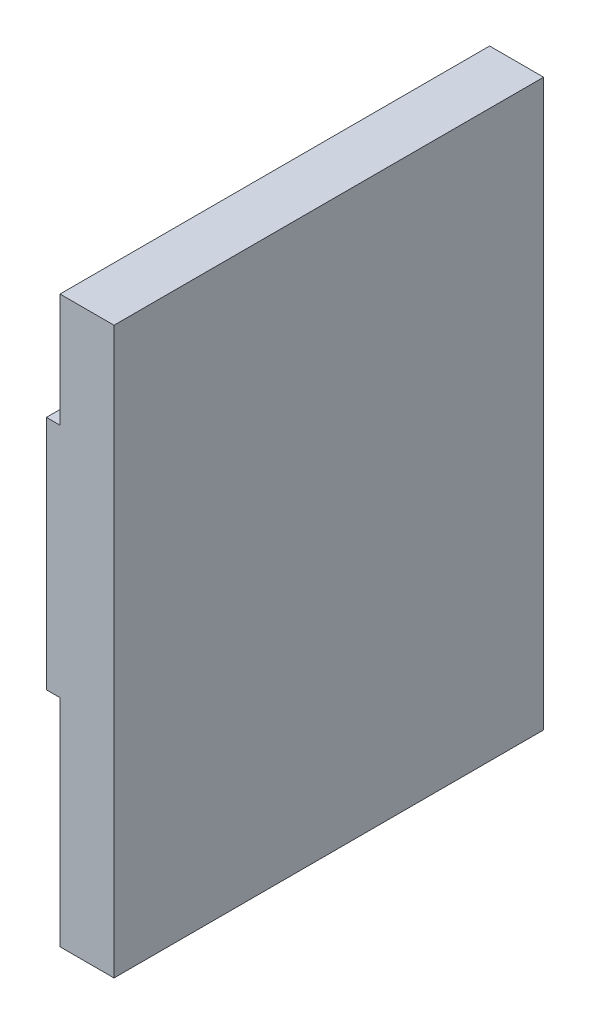
ISO-10303-21;
HEADER;
FILE_DESCRIPTION(('STEP AP214'),'2;1');
FILE_NAME('part.step','',(''),(''),'','','');
FILE_SCHEMA(('AUTOMOTIVE_DESIGN { 1 0 10303 214 1 1 1 1 }'));
ENDSEC;
DATA;
#1=APPLICATION_CONTEXT('core data for automotive mechanical design processes');
#2=APPLICATION_PROTOCOL_DEFINITION('international standard','automotive_design',2000,#1);
#3=PRODUCT_CONTEXT('',#1,'mechanical');
#4=PRODUCT('Part','Part','',(#3));
#5=PRODUCT_RELATED_PRODUCT_CATEGORY('part','',(#4));
#6=PRODUCT_DEFINITION_FORMATION('','',#4);
#7=PRODUCT_DEFINITION_CONTEXT('part definition',#1,'design');
#8=PRODUCT_DEFINITION('design','',#6,#7);
#9=PRODUCT_DEFINITION_SHAPE('','',#8);
#10=(LENGTH_UNIT() NAMED_UNIT(*) SI_UNIT(.MILLI.,.METRE.));
#11=(NAMED_UNIT(*) PLANE_ANGLE_UNIT() SI_UNIT($,.RADIAN.));
#12=(NAMED_UNIT(*) SI_UNIT($,.STERADIAN.) SOLID_ANGLE_UNIT());
#13=UNCERTAINTY_MEASURE_WITH_UNIT(LENGTH_MEASURE(1.E-05),#10,'distance_accuracy_value','');
#14=(GEOMETRIC_REPRESENTATION_CONTEXT(3) GLOBAL_UNCERTAINTY_ASSIGNED_CONTEXT((#13)) GLOBAL_UNIT_ASSIGNED_CONTEXT((#10,
#11,#12)) REPRESENTATION_CONTEXT('',''));
#15=CARTESIAN_POINT('',(0.,0.,0.));
#16=DIRECTION('',(0.,0.,1.));
#17=DIRECTION('',(1.,0.,0.));
#18=AXIS2_PLACEMENT_3D('',#15,#16,#17);
#19=CARTESIAN_POINT('',(-358.5,-1073.,313.5));
#20=DIRECTION('',(0.,0.,-1.));
#21=DIRECTION('',(0.,1.,0.));
#22=AXIS2_PLACEMENT_3D('',#19,#20,#21);
#23=PLANE('',#22);
#24=DIRECTION('',(0.,1.,0.));
#25=VECTOR('',#24,1.);
#26=CARTESIAN_POINT('',(-289.,-1073.,313.5));
#27=LINE('',#26,#25);
#28=CARTESIAN_POINT('',(-289.,-1674.,313.5));
#29=VERTEX_POINT('',#28);
#30=CARTESIAN_POINT('',(-289.,-512.,313.5));
#31=VERTEX_POINT('',#30);
#32=EDGE_CURVE('E83',#29,#31,#27,.T.);
#33=ORIENTED_EDGE('',*,*,#32,.F.);
#34=DIRECTION('',(1.,0.,0.));
#35=VECTOR('',#34,1.);
#36=CARTESIAN_POINT('',(-344.5,-1674.,313.5));
#37=LINE('',#36,#35);
#38=CARTESIAN_POINT('',(-400.,-1674.,313.5));
#39=VERTEX_POINT('',#38);
#40=EDGE_CURVE('E141',#39,#29,#37,.T.);
#41=ORIENTED_EDGE('',*,*,#40,.F.);
#42=DIRECTION('',(0.,-1.,0.));
#43=VECTOR('',#42,1.);
#44=CARTESIAN_POINT('',(-400.,-1432.25,313.5));
#45=LINE('',#44,#43);
#46=CARTESIAN_POINT('',(-400.,-1230.5,313.5));
#47=VERTEX_POINT('',#46);
#48=EDGE_CURVE('E142',#47,#39,#45,.T.);
#49=ORIENTED_EDGE('',*,*,#48,.F.);
#50=DIRECTION('',(1.,0.,0.));
#51=VECTOR('',#50,1.);
#52=CARTESIAN_POINT('',(-414.,-1230.5,313.5));
#53=LINE('',#52,#51);
#54=CARTESIAN_POINT('',(-428.,-1230.5,313.5));
#55=VERTEX_POINT('',#54);
#56=EDGE_CURVE('E144',#55,#47,#53,.T.);
#57=ORIENTED_EDGE('',*,*,#56,.F.);
#58=DIRECTION('',(0.,-1.,0.));
#59=VECTOR('',#58,1.);
#60=CARTESIAN_POINT('',(-428.,-988.,313.5));
#61=LINE('',#60,#59);
#62=CARTESIAN_POINT('',(-428.,-745.5,313.5));
#63=VERTEX_POINT('',#62);
#64=EDGE_CURVE('E108',#63,#55,#61,.T.);
#65=ORIENTED_EDGE('',*,*,#64,.F.);
#66=DIRECTION('',(1.,0.,0.));
#67=VECTOR('',#66,1.);
#68=CARTESIAN_POINT('',(-414.,-745.5,313.5));
#69=LINE('',#68,#67);
#70=CARTESIAN_POINT('',(-400.,-745.5,313.5));
#71=VERTEX_POINT('',#70);
#72=EDGE_CURVE('E114',#71,#63,#69,.F.);
#73=ORIENTED_EDGE('',*,*,#72,.F.);
#74=DIRECTION('',(0.,-1.,0.));
#75=VECTOR('',#74,1.);
#76=CARTESIAN_POINT('',(-400.,-628.75,313.5));
#77=LINE('',#76,#75);
#78=CARTESIAN_POINT('',(-400.,-512.,313.5));
#79=VERTEX_POINT('',#78);
#80=EDGE_CURVE('E161',#79,#71,#77,.T.);
#81=ORIENTED_EDGE('',*,*,#80,.F.);
#82=DIRECTION('',(1.,0.,0.));
#83=VECTOR('',#82,1.);
#84=CARTESIAN_POINT('',(-344.5,-512.,313.5));
#85=LINE('',#84,#83);
#86=EDGE_CURVE('E168',#31,#79,#85,.F.);
#87=ORIENTED_EDGE('',*,*,#86,.F.);
#88=EDGE_LOOP('',(#33,#41,#49,#57,#65,#73,#81,#87));
#89=FACE_BOUND('',#88,.T.);
#90=ADVANCED_FACE('F18',(#89),#23,.T.);
#91=CARTESIAN_POINT('',(-344.5,-1674.,755.));
#92=DIRECTION('',(0.,-1.,0.));
#93=DIRECTION('',(0.,0.,-1.));
#94=AXIS2_PLACEMENT_3D('',#91,#92,#93);
#95=PLANE('',#94);
#96=DIRECTION('',(0.,0.,-1.));
#97=VECTOR('',#96,1.);
#98=CARTESIAN_POINT('',(-289.,-1674.,755.));
#99=LINE('',#98,#97);
#100=CARTESIAN_POINT('',(-289.,-1674.,1196.5));
#101=VERTEX_POINT('',#100);
#102=EDGE_CURVE('E137',#101,#29,#99,.T.);
#103=ORIENTED_EDGE('',*,*,#102,.F.);
#104=DIRECTION('',(-1.,0.,0.));
#105=VECTOR('',#104,1.);
#106=CARTESIAN_POINT('',(-358.5,-1674.,1196.5));
#107=LINE('',#106,#105);
#108=CARTESIAN_POINT('',(-400.,-1674.,1196.5));
#109=VERTEX_POINT('',#108);
#110=EDGE_CURVE('E22',#101,#109,#107,.T.);
#111=ORIENTED_EDGE('',*,*,#110,.T.);
#112=DIRECTION('',(0.,0.,1.));
#113=VECTOR('',#112,1.);
#114=CARTESIAN_POINT('',(-400.,-1674.,755.));
#115=LINE('',#114,#113);
#116=EDGE_CURVE('E69',#39,#109,#115,.T.);
#117=ORIENTED_EDGE('',*,*,#116,.F.);
#118=ORIENTED_EDGE('',*,*,#40,.T.);
#119=EDGE_LOOP('',(#103,#111,#117,#118));
#120=FACE_BOUND('',#119,.T.);
#121=ADVANCED_FACE('F20',(#120),#95,.T.);
#122=CARTESIAN_POINT('',(-400.,-1432.25,755.));
#123=DIRECTION('',(-1.,0.,0.));
#124=DIRECTION('',(0.,-1.,0.));
#125=AXIS2_PLACEMENT_3D('',#122,#123,#124);
#126=PLANE('',#125);
#127=ORIENTED_EDGE('',*,*,#116,.T.);
#128=DIRECTION('',(0.,-1.,0.));
#129=VECTOR('',#128,1.);
#130=CARTESIAN_POINT('',(-400.,-1432.25,1196.5));
#131=LINE('',#130,#129);
#132=CARTESIAN_POINT('',(-400.,-1230.5,1196.5));
#133=VERTEX_POINT('',#132);
#134=EDGE_CURVE('E130',#109,#133,#131,.F.);
#135=ORIENTED_EDGE('',*,*,#134,.T.);
#136=DIRECTION('',(0.,0.,-1.));
#137=VECTOR('',#136,1.);
#138=CARTESIAN_POINT('',(-400.,-1230.5,755.));
#139=LINE('',#138,#137);
#140=EDGE_CURVE('E128',#47,#133,#139,.F.);
#141=ORIENTED_EDGE('',*,*,#140,.F.);
#142=ORIENTED_EDGE('',*,*,#48,.T.);
#143=EDGE_LOOP('',(#127,#135,#141,#142));
#144=FACE_BOUND('',#143,.T.);
#145=ADVANCED_FACE('F205',(#144),#126,.T.);
#146=CARTESIAN_POINT('',(-414.,-1230.5,755.));
#147=DIRECTION('',(0.,-1.,0.));
#148=DIRECTION('',(0.,0.,-1.));
#149=AXIS2_PLACEMENT_3D('',#146,#147,#148);
#150=PLANE('',#149);
#151=ORIENTED_EDGE('',*,*,#140,.T.);
#152=DIRECTION('',(1.,0.,0.));
#153=VECTOR('',#152,1.);
#154=CARTESIAN_POINT('',(-414.,-1230.5,1196.5));
#155=LINE('',#154,#153);
#156=CARTESIAN_POINT('',(-428.,-1230.5,1196.5));
#157=VERTEX_POINT('',#156);
#158=EDGE_CURVE('E120',#133,#157,#155,.F.);
#159=ORIENTED_EDGE('',*,*,#158,.T.);
#160=DIRECTION('',(0.,0.,1.));
#161=VECTOR('',#160,1.);
#162=CARTESIAN_POINT('',(-428.,-1230.5,755.));
#163=LINE('',#162,#161);
#164=EDGE_CURVE('E101',#55,#157,#163,.T.);
#165=ORIENTED_EDGE('',*,*,#164,.F.);
#166=ORIENTED_EDGE('',*,*,#56,.T.);
#167=EDGE_LOOP('',(#151,#159,#165,#166));
#168=FACE_BOUND('',#167,.T.);
#169=ADVANCED_FACE('F126',(#168),#150,.T.);
#170=CARTESIAN_POINT('',(-428.,-988.,755.));
#171=DIRECTION('',(-1.,0.,0.));
#172=DIRECTION('',(0.,-1.,0.));
#173=AXIS2_PLACEMENT_3D('',#170,#171,#172);
#174=PLANE('',#173);
#175=ORIENTED_EDGE('',*,*,#164,.T.);
#176=DIRECTION('',(0.,-1.,0.));
#177=VECTOR('',#176,1.);
#178=CARTESIAN_POINT('',(-428.,-988.,1196.5));
#179=LINE('',#178,#177);
#180=CARTESIAN_POINT('',(-428.,-745.5,1196.5));
#181=VERTEX_POINT('',#180);
#182=EDGE_CURVE('E105',#157,#181,#179,.F.);
#183=ORIENTED_EDGE('',*,*,#182,.T.);
#184=DIRECTION('',(0.,0.,1.));
#185=VECTOR('',#184,1.);
#186=CARTESIAN_POINT('',(-428.,-745.5,755.));
#187=LINE('',#186,#185);
#188=EDGE_CURVE('E158',#63,#181,#187,.T.);
#189=ORIENTED_EDGE('',*,*,#188,.F.);
#190=ORIENTED_EDGE('',*,*,#64,.T.);
#191=EDGE_LOOP('',(#175,#183,#189,#190));
#192=FACE_BOUND('',#191,.T.);
#193=ADVANCED_FACE('F103',(#192),#174,.T.);
#194=CARTESIAN_POINT('',(-414.,-745.5,755.));
#195=DIRECTION('',(0.,1.,0.));
#196=DIRECTION('',(0.,0.,1.));
#197=AXIS2_PLACEMENT_3D('',#194,#195,#196);
#198=PLANE('',#197);
#199=ORIENTED_EDGE('',*,*,#188,.T.);
#200=DIRECTION('',(1.,0.,0.));
#201=VECTOR('',#200,1.);
#202=CARTESIAN_POINT('',(-414.,-745.5,1196.5));
#203=LINE('',#202,#201);
#204=CARTESIAN_POINT('',(-400.,-745.5,1196.5));
#205=VERTEX_POINT('',#204);
#206=EDGE_CURVE('E123',#181,#205,#203,.T.);
#207=ORIENTED_EDGE('',*,*,#206,.T.);
#208=DIRECTION('',(0.,0.,1.));
#209=VECTOR('',#208,1.);
#210=CARTESIAN_POINT('',(-400.,-745.5,755.));
#211=LINE('',#210,#209);
#212=EDGE_CURVE('E165',#71,#205,#211,.T.);
#213=ORIENTED_EDGE('',*,*,#212,.F.);
#214=ORIENTED_EDGE('',*,*,#72,.T.);
#215=EDGE_LOOP('',(#199,#207,#213,#214));
#216=FACE_BOUND('',#215,.T.);
#217=ADVANCED_FACE('F191',(#216),#198,.T.);
#218=CARTESIAN_POINT('',(-400.,-628.75,755.));
#219=DIRECTION('',(-1.,0.,0.));
#220=DIRECTION('',(0.,-1.,0.));
#221=AXIS2_PLACEMENT_3D('',#218,#219,#220);
#222=PLANE('',#221);
#223=ORIENTED_EDGE('',*,*,#212,.T.);
#224=DIRECTION('',(0.,-1.,0.));
#225=VECTOR('',#224,1.);
#226=CARTESIAN_POINT('',(-400.,-628.75,1196.5));
#227=LINE('',#226,#225);
#228=CARTESIAN_POINT('',(-400.,-512.,1196.5));
#229=VERTEX_POINT('',#228);
#230=EDGE_CURVE('E184',#205,#229,#227,.F.);
#231=ORIENTED_EDGE('',*,*,#230,.T.);
#232=DIRECTION('',(0.,0.,1.));
#233=VECTOR('',#232,1.);
#234=CARTESIAN_POINT('',(-400.,-512.,755.));
#235=LINE('',#234,#233);
#236=EDGE_CURVE('E140',#79,#229,#235,.T.);
#237=ORIENTED_EDGE('',*,*,#236,.F.);
#238=ORIENTED_EDGE('',*,*,#80,.T.);
#239=EDGE_LOOP('',(#223,#231,#237,#238));
#240=FACE_BOUND('',#239,.T.);
#241=ADVANCED_FACE('F231',(#240),#222,.T.);
#242=CARTESIAN_POINT('',(-344.5,-512.,755.));
#243=DIRECTION('',(0.,1.,0.));
#244=DIRECTION('',(0.,0.,1.));
#245=AXIS2_PLACEMENT_3D('',#242,#243,#244);
#246=PLANE('',#245);
#247=ORIENTED_EDGE('',*,*,#236,.T.);
#248=DIRECTION('',(1.,0.,0.));
#249=VECTOR('',#248,1.);
#250=CARTESIAN_POINT('',(-344.5,-512.,1196.5));
#251=LINE('',#250,#249);
#252=CARTESIAN_POINT('',(-289.,-512.,1196.5));
#253=VERTEX_POINT('',#252);
#254=EDGE_CURVE('E29',#229,#253,#251,.T.);
#255=ORIENTED_EDGE('',*,*,#254,.T.);
#256=DIRECTION('',(0.,0.,1.));
#257=VECTOR('',#256,1.);
#258=CARTESIAN_POINT('',(-289.,-512.,755.));
#259=LINE('',#258,#257);
#260=EDGE_CURVE('E41',#31,#253,#259,.T.);
#261=ORIENTED_EDGE('',*,*,#260,.F.);
#262=ORIENTED_EDGE('',*,*,#86,.T.);
#263=EDGE_LOOP('',(#247,#255,#261,#262));
#264=FACE_BOUND('',#263,.T.);
#265=ADVANCED_FACE('F227',(#264),#246,.T.);
#266=CARTESIAN_POINT('',(-289.,-1073.,755.));
#267=DIRECTION('',(1.,0.,0.));
#268=DIRECTION('',(0.,1.,0.));
#269=AXIS2_PLACEMENT_3D('',#266,#267,#268);
#270=PLANE('',#269);
#271=ORIENTED_EDGE('',*,*,#260,.T.);
#272=DIRECTION('',(0.,1.,0.));
#273=VECTOR('',#272,1.);
#274=CARTESIAN_POINT('',(-289.,-1073.,1196.5));
#275=LINE('',#274,#273);
#276=EDGE_CURVE('E11',#253,#101,#275,.F.);
#277=ORIENTED_EDGE('',*,*,#276,.T.);
#278=ORIENTED_EDGE('',*,*,#102,.T.);
#279=ORIENTED_EDGE('',*,*,#32,.T.);
#280=EDGE_LOOP('',(#271,#277,#278,#279));
#281=FACE_BOUND('',#280,.T.);
#282=ADVANCED_FACE('F225',(#281),#270,.T.);
#283=CARTESIAN_POINT('',(-358.5,-1073.,1196.5));
#284=DIRECTION('',(0.,0.,-1.));
#285=DIRECTION('',(0.,1.,0.));
#286=AXIS2_PLACEMENT_3D('',#283,#284,#285);
#287=PLANE('',#286);
#288=ORIENTED_EDGE('',*,*,#254,.F.);
#289=ORIENTED_EDGE('',*,*,#230,.F.);
#290=ORIENTED_EDGE('',*,*,#206,.F.);
#291=ORIENTED_EDGE('',*,*,#182,.F.);
#292=ORIENTED_EDGE('',*,*,#158,.F.);
#293=ORIENTED_EDGE('',*,*,#134,.F.);
#294=ORIENTED_EDGE('',*,*,#110,.F.);
#295=ORIENTED_EDGE('',*,*,#276,.F.);
#296=EDGE_LOOP('',(#288,#289,#290,#291,#292,#293,#294,#295));
#297=FACE_BOUND('',#296,.T.);
#298=ADVANCED_FACE('F119',(#297),#287,.F.);
#299=CLOSED_SHELL('',(#90,#121,#145,#169,#193,#217,#241,#265,#282,#298));
#300=MANIFOLD_SOLID_BREP('B1',#299);
#301=ADVANCED_BREP_SHAPE_REPRESENTATION('',(#18,#300),#14);
#302=SHAPE_DEFINITION_REPRESENTATION(#9,#301);
ENDSEC;
END-ISO-10303-21;
